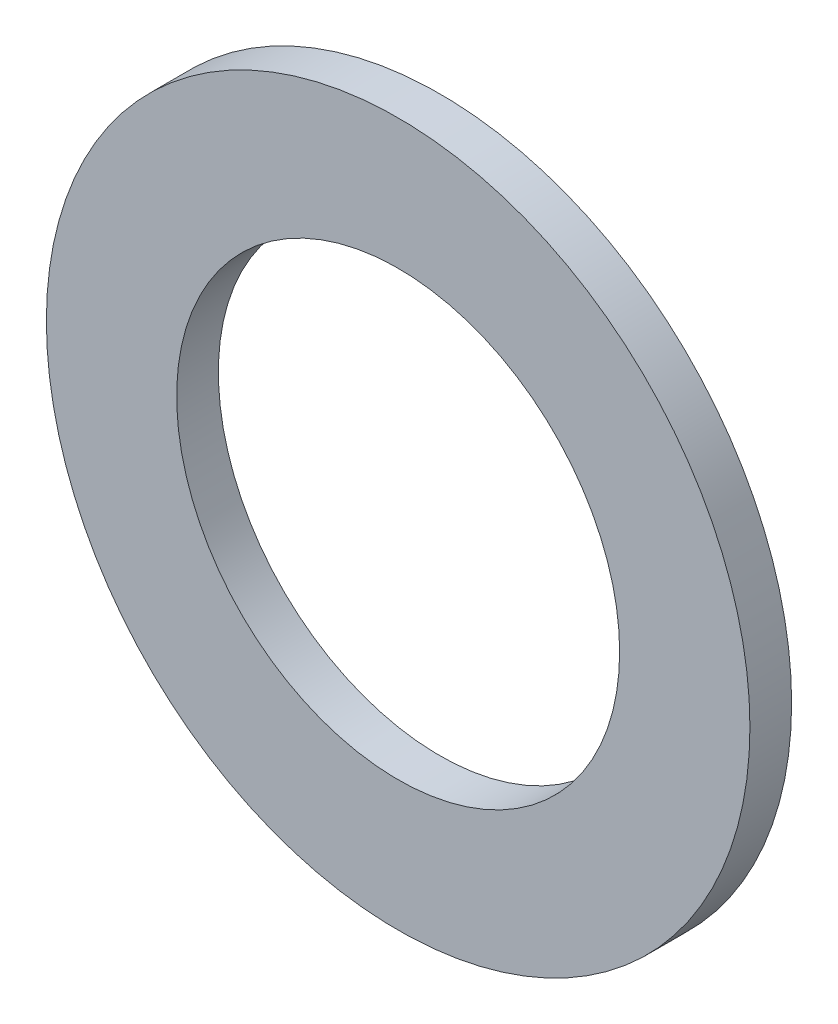
ISO-10303-21;
HEADER;
FILE_DESCRIPTION(('STEP AP214'),'2;1');
FILE_NAME('part.step','',(''),(''),'','','');
FILE_SCHEMA(('AUTOMOTIVE_DESIGN { 1 0 10303 214 1 1 1 1 }'));
ENDSEC;
DATA;
#1=APPLICATION_CONTEXT('core data for automotive mechanical design processes');
#2=APPLICATION_PROTOCOL_DEFINITION('international standard','automotive_design',2000,#1);
#3=PRODUCT_CONTEXT('',#1,'mechanical');
#4=PRODUCT('Part','Part','',(#3));
#5=PRODUCT_RELATED_PRODUCT_CATEGORY('part','',(#4));
#6=PRODUCT_DEFINITION_FORMATION('','',#4);
#7=PRODUCT_DEFINITION_CONTEXT('part definition',#1,'design');
#8=PRODUCT_DEFINITION('design','',#6,#7);
#9=PRODUCT_DEFINITION_SHAPE('','',#8);
#10=(LENGTH_UNIT() NAMED_UNIT(*) SI_UNIT(.MILLI.,.METRE.));
#11=(NAMED_UNIT(*) PLANE_ANGLE_UNIT() SI_UNIT($,.RADIAN.));
#12=(NAMED_UNIT(*) SI_UNIT($,.STERADIAN.) SOLID_ANGLE_UNIT());
#13=UNCERTAINTY_MEASURE_WITH_UNIT(LENGTH_MEASURE(1.E-05),#10,'distance_accuracy_value','');
#14=(GEOMETRIC_REPRESENTATION_CONTEXT(3) GLOBAL_UNCERTAINTY_ASSIGNED_CONTEXT((#13)) GLOBAL_UNIT_ASSIGNED_CONTEXT((#10,
#11,#12)) REPRESENTATION_CONTEXT('',''));
#15=CARTESIAN_POINT('',(0.,0.,0.));
#16=DIRECTION('',(0.,0.,1.));
#17=DIRECTION('',(1.,0.,0.));
#18=AXIS2_PLACEMENT_3D('',#15,#16,#17);
#19=CARTESIAN_POINT('',(0.,0.,0.4));
#20=DIRECTION('',(0.,0.,1.));
#21=DIRECTION('',(1.,0.,0.));
#22=AXIS2_PLACEMENT_3D('',#19,#20,#21);
#23=PLANE('',#22);
#24=CARTESIAN_POINT('',(0.,0.,0.4));
#25=DIRECTION('',(0.,0.,1.));
#26=DIRECTION('',(1.,0.,0.));
#27=AXIS2_PLACEMENT_3D('',#24,#25,#26);
#28=CIRCLE('',#27,6.75);
#29=CARTESIAN_POINT('',(6.75,0.,0.4));
#30=VERTEX_POINT('',#29);
#31=EDGE_CURVE('E10',#30,#30,#28,.T.);
#32=ORIENTED_EDGE('',*,*,#31,.T.);
#33=EDGE_LOOP('',(#32));
#34=FACE_BOUND('',#33,.T.);
#35=CARTESIAN_POINT('',(0.,0.,0.4));
#36=DIRECTION('',(0.,0.,1.));
#37=DIRECTION('',(1.,0.,0.));
#38=AXIS2_PLACEMENT_3D('',#35,#36,#37);
#39=CIRCLE('',#38,4.25);
#40=CARTESIAN_POINT('',(4.25,0.,0.4));
#41=VERTEX_POINT('',#40);
#42=EDGE_CURVE('E26',#41,#41,#39,.T.);
#43=ORIENTED_EDGE('',*,*,#42,.F.);
#44=EDGE_LOOP('',(#43));
#45=FACE_BOUND('',#44,.T.);
#46=ADVANCED_FACE('F15',(#34,#45),#23,.T.);
#47=CARTESIAN_POINT('',(0.,0.,-0.4));
#48=DIRECTION('',(0.,0.,1.));
#49=DIRECTION('',(1.,0.,0.));
#50=AXIS2_PLACEMENT_3D('',#47,#48,#49);
#51=PLANE('',#50);
#52=CARTESIAN_POINT('',(0.,0.,-0.4));
#53=DIRECTION('',(0.,0.,1.));
#54=DIRECTION('',(1.,0.,0.));
#55=AXIS2_PLACEMENT_3D('',#52,#53,#54);
#56=CIRCLE('',#55,6.75);
#57=CARTESIAN_POINT('',(6.75,0.,-0.4));
#58=VERTEX_POINT('',#57);
#59=EDGE_CURVE('E19',#58,#58,#56,.T.);
#60=ORIENTED_EDGE('',*,*,#59,.F.);
#61=EDGE_LOOP('',(#60));
#62=FACE_BOUND('',#61,.T.);
#63=CARTESIAN_POINT('',(0.,0.,-0.4));
#64=DIRECTION('',(0.,0.,1.));
#65=DIRECTION('',(1.,0.,0.));
#66=AXIS2_PLACEMENT_3D('',#63,#64,#65);
#67=CIRCLE('',#66,4.25);
#68=CARTESIAN_POINT('',(4.25,0.,-0.4));
#69=VERTEX_POINT('',#68);
#70=EDGE_CURVE('E28',#69,#69,#67,.T.);
#71=ORIENTED_EDGE('',*,*,#70,.T.);
#72=EDGE_LOOP('',(#71));
#73=FACE_BOUND('',#72,.T.);
#74=ADVANCED_FACE('F38',(#62,#73),#51,.F.);
#75=CARTESIAN_POINT('',(0.,0.,0.4));
#76=DIRECTION('',(0.,0.,-1.));
#77=DIRECTION('',(-1.,0.,0.));
#78=AXIS2_PLACEMENT_3D('',#75,#76,#77);
#79=CYLINDRICAL_SURFACE('',#78,6.75);
#80=ORIENTED_EDGE('',*,*,#31,.F.);
#81=EDGE_LOOP('',(#80));
#82=FACE_BOUND('',#81,.T.);
#83=ORIENTED_EDGE('',*,*,#59,.T.);
#84=EDGE_LOOP('',(#83));
#85=FACE_BOUND('',#84,.T.);
#86=ADVANCED_FACE('F17',(#82,#85),#79,.T.);
#87=CARTESIAN_POINT('',(0.,0.,0.4));
#88=DIRECTION('',(0.,0.,-1.));
#89=DIRECTION('',(-1.,0.,0.));
#90=AXIS2_PLACEMENT_3D('',#87,#88,#89);
#91=CYLINDRICAL_SURFACE('',#90,4.25);
#92=ORIENTED_EDGE('',*,*,#42,.T.);
#93=EDGE_LOOP('',(#92));
#94=FACE_BOUND('',#93,.T.);
#95=ORIENTED_EDGE('',*,*,#70,.F.);
#96=EDGE_LOOP('',(#95));
#97=FACE_BOUND('',#96,.T.);
#98=ADVANCED_FACE('F34',(#94,#97),#91,.F.);
#99=CLOSED_SHELL('',(#46,#74,#86,#98));
#100=MANIFOLD_SOLID_BREP('B1',#99);
#101=ADVANCED_BREP_SHAPE_REPRESENTATION('',(#18,#100),#14);
#102=SHAPE_DEFINITION_REPRESENTATION(#9,#101);
ENDSEC;
END-ISO-10303-21;
